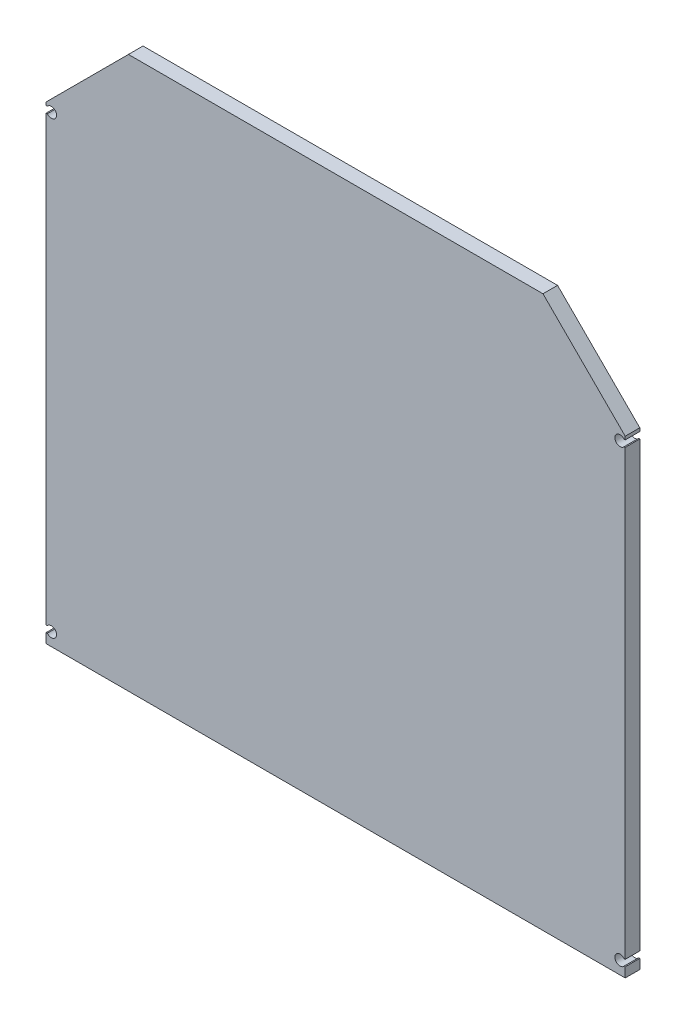
ISO-10303-21;
HEADER;
FILE_DESCRIPTION(('STEP AP214'),'2;1');
FILE_NAME('part.step','',(''),(''),'','','');
FILE_SCHEMA(('AUTOMOTIVE_DESIGN { 1 0 10303 214 1 1 1 1 }'));
ENDSEC;
DATA;
#1=APPLICATION_CONTEXT('core data for automotive mechanical design processes');
#2=APPLICATION_PROTOCOL_DEFINITION('international standard','automotive_design',2000,#1);
#3=PRODUCT_CONTEXT('',#1,'mechanical');
#4=PRODUCT('Part','Part','',(#3));
#5=PRODUCT_RELATED_PRODUCT_CATEGORY('part','',(#4));
#6=PRODUCT_DEFINITION_FORMATION('','',#4);
#7=PRODUCT_DEFINITION_CONTEXT('part definition',#1,'design');
#8=PRODUCT_DEFINITION('design','',#6,#7);
#9=PRODUCT_DEFINITION_SHAPE('','',#8);
#10=(LENGTH_UNIT() NAMED_UNIT(*) SI_UNIT(.MILLI.,.METRE.));
#11=(NAMED_UNIT(*) PLANE_ANGLE_UNIT() SI_UNIT($,.RADIAN.));
#12=(NAMED_UNIT(*) SI_UNIT($,.STERADIAN.) SOLID_ANGLE_UNIT());
#13=UNCERTAINTY_MEASURE_WITH_UNIT(LENGTH_MEASURE(1.E-05),#10,'distance_accuracy_value','');
#14=(GEOMETRIC_REPRESENTATION_CONTEXT(3) GLOBAL_UNCERTAINTY_ASSIGNED_CONTEXT((#13)) GLOBAL_UNIT_ASSIGNED_CONTEXT((#10,
#11,#12)) REPRESENTATION_CONTEXT('',''));
#15=CARTESIAN_POINT('',(0.,0.,0.));
#16=DIRECTION('',(0.,0.,1.));
#17=DIRECTION('',(1.,0.,0.));
#18=AXIS2_PLACEMENT_3D('',#15,#16,#17);
#19=CARTESIAN_POINT('',(-110.00463005735,72.3624357502469,5.6388));
#20=DIRECTION('',(0.,0.,-1.));
#21=DIRECTION('',(-1.,0.,0.));
#22=AXIS2_PLACEMENT_3D('',#19,#20,#21);
#23=CYLINDRICAL_SURFACE('',#22,1.99999999999999);
#24=CARTESIAN_POINT('',(-110.00463005735,72.3624357502469,0.));
#25=DIRECTION('',(0.,0.,-1.));
#26=DIRECTION('',(1.,0.,0.));
#27=AXIS2_PLACEMENT_3D('',#24,#25,#26);
#28=CIRCLE('',#27,1.99999999999999);
#29=CARTESIAN_POINT('',(-111.565879556949,73.6124357502469,0.));
#30=VERTEX_POINT('',#29);
#31=CARTESIAN_POINT('',(-111.565879556949,71.1124357502469,0.));
#32=VERTEX_POINT('',#31);
#33=EDGE_CURVE('E213',#30,#32,#28,.T.);
#34=ORIENTED_EDGE('',*,*,#33,.T.);
#35=DIRECTION('',(0.,0.,-1.));
#36=VECTOR('',#35,1.);
#37=CARTESIAN_POINT('',(-111.565879556949,71.1124357502469,5.6388));
#38=LINE('',#37,#36);
#39=CARTESIAN_POINT('',(-111.565879556949,71.1124357502469,5.6388));
#40=VERTEX_POINT('',#39);
#41=EDGE_CURVE('E11',#40,#32,#38,.T.);
#42=ORIENTED_EDGE('',*,*,#41,.F.);
#43=CARTESIAN_POINT('',(-110.00463005735,72.3624357502469,5.6388));
#44=DIRECTION('',(0.,0.,-1.));
#45=DIRECTION('',(1.,0.,0.));
#46=AXIS2_PLACEMENT_3D('',#43,#44,#45);
#47=CIRCLE('',#46,1.99999999999999);
#48=CARTESIAN_POINT('',(-111.565879556949,73.6124357502469,5.6388));
#49=VERTEX_POINT('',#48);
#50=EDGE_CURVE('E255',#49,#40,#47,.T.);
#51=ORIENTED_EDGE('',*,*,#50,.F.);
#52=DIRECTION('',(0.,0.,-1.));
#53=VECTOR('',#52,1.);
#54=CARTESIAN_POINT('',(-111.565879556949,73.6124357502469,5.6388));
#55=LINE('',#54,#53);
#56=EDGE_CURVE('E209',#49,#30,#55,.T.);
#57=ORIENTED_EDGE('',*,*,#56,.T.);
#58=EDGE_LOOP('',(#34,#42,#51,#57));
#59=FACE_BOUND('',#58,.T.);
#60=ADVANCED_FACE('F33',(#59),#23,.F.);
#61=CARTESIAN_POINT('',(-111.565879556949,71.1124357502469,5.6388));
#62=DIRECTION('',(0.,-1.,0.));
#63=DIRECTION('',(0.,0.,-1.));
#64=AXIS2_PLACEMENT_3D('',#61,#62,#63);
#65=PLANE('',#64);
#66=DIRECTION('',(-1.,0.,0.));
#67=VECTOR('',#66,1.);
#68=CARTESIAN_POINT('',(-111.565879556949,71.1124357502469,0.));
#69=LINE('',#68,#67);
#70=CARTESIAN_POINT('',(-112.00463005735,71.1124357502469,0.));
#71=VERTEX_POINT('',#70);
#72=EDGE_CURVE('E216',#32,#71,#69,.T.);
#73=ORIENTED_EDGE('',*,*,#72,.T.);
#74=DIRECTION('',(0.,0.,-1.));
#75=VECTOR('',#74,1.);
#76=CARTESIAN_POINT('',(-112.00463005735,71.1124357502469,5.6388));
#77=LINE('',#76,#75);
#78=CARTESIAN_POINT('',(-112.00463005735,71.1124357502469,5.6388));
#79=VERTEX_POINT('',#78);
#80=EDGE_CURVE('E41',#79,#71,#77,.T.);
#81=ORIENTED_EDGE('',*,*,#80,.F.);
#82=DIRECTION('',(-1.,0.,0.));
#83=VECTOR('',#82,1.);
#84=CARTESIAN_POINT('',(-111.565879556949,71.1124357502469,5.6388));
#85=LINE('',#84,#83);
#86=EDGE_CURVE('E134',#40,#79,#85,.T.);
#87=ORIENTED_EDGE('',*,*,#86,.F.);
#88=ORIENTED_EDGE('',*,*,#41,.T.);
#89=EDGE_LOOP('',(#73,#81,#87,#88));
#90=FACE_BOUND('',#89,.T.);
#91=ADVANCED_FACE('F383',(#90),#65,.F.);
#92=CARTESIAN_POINT('',(-112.00463005735,71.1124357502469,5.6388));
#93=DIRECTION('',(1.,0.,0.));
#94=DIRECTION('',(0.,1.,0.));
#95=AXIS2_PLACEMENT_3D('',#92,#93,#94);
#96=PLANE('',#95);
#97=DIRECTION('',(0.,-1.,0.));
#98=VECTOR('',#97,1.);
#99=CARTESIAN_POINT('',(-112.00463005735,71.1124357502469,0.));
#100=LINE('',#99,#98);
#101=CARTESIAN_POINT('',(-112.00463005735,-100.425,0.));
#102=VERTEX_POINT('',#101);
#103=EDGE_CURVE('E218',#71,#102,#100,.T.);
#104=ORIENTED_EDGE('',*,*,#103,.T.);
#105=DIRECTION('',(0.,0.,-1.));
#106=VECTOR('',#105,1.);
#107=CARTESIAN_POINT('',(-112.00463005735,-100.425,5.6388));
#108=LINE('',#107,#106);
#109=CARTESIAN_POINT('',(-112.00463005735,-100.425,5.6388));
#110=VERTEX_POINT('',#109);
#111=EDGE_CURVE('E304',#110,#102,#108,.T.);
#112=ORIENTED_EDGE('',*,*,#111,.F.);
#113=DIRECTION('',(0.,-1.,0.));
#114=VECTOR('',#113,1.);
#115=CARTESIAN_POINT('',(-112.00463005735,71.1124357502469,5.6388));
#116=LINE('',#115,#114);
#117=EDGE_CURVE('E312',#79,#110,#116,.T.);
#118=ORIENTED_EDGE('',*,*,#117,.F.);
#119=ORIENTED_EDGE('',*,*,#80,.T.);
#120=EDGE_LOOP('',(#104,#112,#118,#119));
#121=FACE_BOUND('',#120,.T.);
#122=ADVANCED_FACE('F310',(#121),#96,.F.);
#123=CARTESIAN_POINT('',(-112.00463005735,-100.425,5.6388));
#124=DIRECTION('',(0.,1.,0.));
#125=DIRECTION('',(0.,0.,1.));
#126=AXIS2_PLACEMENT_3D('',#123,#124,#125);
#127=PLANE('',#126);
#128=DIRECTION('',(1.,0.,0.));
#129=VECTOR('',#128,1.);
#130=CARTESIAN_POINT('',(-112.00463005735,-100.425,0.));
#131=LINE('',#130,#129);
#132=CARTESIAN_POINT('',(-111.565879556949,-100.425,0.));
#133=VERTEX_POINT('',#132);
#134=EDGE_CURVE('E220',#102,#133,#131,.T.);
#135=ORIENTED_EDGE('',*,*,#134,.T.);
#136=DIRECTION('',(0.,0.,-1.));
#137=VECTOR('',#136,1.);
#138=CARTESIAN_POINT('',(-111.565879556949,-100.425,5.6388));
#139=LINE('',#138,#137);
#140=CARTESIAN_POINT('',(-111.565879556949,-100.425,5.6388));
#141=VERTEX_POINT('',#140);
#142=EDGE_CURVE('E301',#141,#133,#139,.T.);
#143=ORIENTED_EDGE('',*,*,#142,.F.);
#144=DIRECTION('',(1.,0.,0.));
#145=VECTOR('',#144,1.);
#146=CARTESIAN_POINT('',(-112.00463005735,-100.425,5.6388));
#147=LINE('',#146,#145);
#148=EDGE_CURVE('E330',#110,#141,#147,.T.);
#149=ORIENTED_EDGE('',*,*,#148,.F.);
#150=ORIENTED_EDGE('',*,*,#111,.T.);
#151=EDGE_LOOP('',(#135,#143,#149,#150));
#152=FACE_BOUND('',#151,.T.);
#153=ADVANCED_FACE('F321',(#152),#127,.F.);
#154=CARTESIAN_POINT('',(-110.00463005735,-101.675,5.6388));
#155=DIRECTION('',(0.,0.,-1.));
#156=DIRECTION('',(-1.,0.,0.));
#157=AXIS2_PLACEMENT_3D('',#154,#155,#156);
#158=CYLINDRICAL_SURFACE('',#157,1.99999999999998);
#159=CARTESIAN_POINT('',(-110.00463005735,-101.675,0.));
#160=DIRECTION('',(0.,0.,-1.));
#161=DIRECTION('',(-1.,0.,0.));
#162=AXIS2_PLACEMENT_3D('',#159,#160,#161);
#163=CIRCLE('',#162,1.99999999999998);
#164=CARTESIAN_POINT('',(-111.565879556949,-102.925,0.));
#165=VERTEX_POINT('',#164);
#166=EDGE_CURVE('E222',#133,#165,#163,.T.);
#167=ORIENTED_EDGE('',*,*,#166,.T.);
#168=DIRECTION('',(0.,0.,-1.));
#169=VECTOR('',#168,1.);
#170=CARTESIAN_POINT('',(-111.565879556949,-102.925,5.6388));
#171=LINE('',#170,#169);
#172=CARTESIAN_POINT('',(-111.565879556949,-102.925,5.6388));
#173=VERTEX_POINT('',#172);
#174=EDGE_CURVE('E298',#173,#165,#171,.T.);
#175=ORIENTED_EDGE('',*,*,#174,.F.);
#176=CARTESIAN_POINT('',(-110.00463005735,-101.675,5.6388));
#177=DIRECTION('',(0.,0.,-1.));
#178=DIRECTION('',(-1.,0.,0.));
#179=AXIS2_PLACEMENT_3D('',#176,#177,#178);
#180=CIRCLE('',#179,1.99999999999998);
#181=EDGE_CURVE('E327',#141,#173,#180,.T.);
#182=ORIENTED_EDGE('',*,*,#181,.F.);
#183=ORIENTED_EDGE('',*,*,#142,.T.);
#184=EDGE_LOOP('',(#167,#175,#182,#183));
#185=FACE_BOUND('',#184,.T.);
#186=ADVANCED_FACE('F325',(#185),#158,.F.);
#187=CARTESIAN_POINT('',(-111.565879556949,-102.925,5.6388));
#188=DIRECTION('',(0.,-1.,0.));
#189=DIRECTION('',(0.,0.,-1.));
#190=AXIS2_PLACEMENT_3D('',#187,#188,#189);
#191=PLANE('',#190);
#192=DIRECTION('',(-1.,0.,0.));
#193=VECTOR('',#192,1.);
#194=CARTESIAN_POINT('',(-111.565879556949,-102.925,0.));
#195=LINE('',#194,#193);
#196=CARTESIAN_POINT('',(-112.00463005735,-102.925,0.));
#197=VERTEX_POINT('',#196);
#198=EDGE_CURVE('E224',#165,#197,#195,.T.);
#199=ORIENTED_EDGE('',*,*,#198,.T.);
#200=DIRECTION('',(0.,0.,-1.));
#201=VECTOR('',#200,1.);
#202=CARTESIAN_POINT('',(-112.00463005735,-102.925,5.6388));
#203=LINE('',#202,#201);
#204=CARTESIAN_POINT('',(-112.00463005735,-102.925,5.6388));
#205=VERTEX_POINT('',#204);
#206=EDGE_CURVE('E295',#205,#197,#203,.T.);
#207=ORIENTED_EDGE('',*,*,#206,.F.);
#208=DIRECTION('',(-1.,0.,0.));
#209=VECTOR('',#208,1.);
#210=CARTESIAN_POINT('',(-111.565879556949,-102.925,5.6388));
#211=LINE('',#210,#209);
#212=EDGE_CURVE('E329',#173,#205,#211,.T.);
#213=ORIENTED_EDGE('',*,*,#212,.F.);
#214=ORIENTED_EDGE('',*,*,#174,.T.);
#215=EDGE_LOOP('',(#199,#207,#213,#214));
#216=FACE_BOUND('',#215,.T.);
#217=ADVANCED_FACE('F396',(#216),#191,.F.);
#218=CARTESIAN_POINT('',(-112.00463005735,-102.925,5.6388));
#219=DIRECTION('',(1.,0.,0.));
#220=DIRECTION('',(0.,0.,-1.));
#221=AXIS2_PLACEMENT_3D('',#218,#219,#220);
#222=PLANE('',#221);
#223=DIRECTION('',(0.,-1.,0.));
#224=VECTOR('',#223,1.);
#225=CARTESIAN_POINT('',(-112.00463005735,-102.925,0.));
#226=LINE('',#225,#224);
#227=CARTESIAN_POINT('',(-112.00463005735,-106.675,0.));
#228=VERTEX_POINT('',#227);
#229=EDGE_CURVE('E226',#197,#228,#226,.T.);
#230=ORIENTED_EDGE('',*,*,#229,.T.);
#231=DIRECTION('',(0.,0.,-1.));
#232=VECTOR('',#231,1.);
#233=CARTESIAN_POINT('',(-112.00463005735,-106.675,5.6388));
#234=LINE('',#233,#232);
#235=CARTESIAN_POINT('',(-112.00463005735,-106.675,5.6388));
#236=VERTEX_POINT('',#235);
#237=EDGE_CURVE('E292',#236,#228,#234,.T.);
#238=ORIENTED_EDGE('',*,*,#237,.F.);
#239=DIRECTION('',(0.,-1.,0.));
#240=VECTOR('',#239,1.);
#241=CARTESIAN_POINT('',(-112.00463005735,-102.925,5.6388));
#242=LINE('',#241,#240);
#243=EDGE_CURVE('E332',#205,#236,#242,.T.);
#244=ORIENTED_EDGE('',*,*,#243,.F.);
#245=ORIENTED_EDGE('',*,*,#206,.T.);
#246=EDGE_LOOP('',(#230,#238,#244,#245));
#247=FACE_BOUND('',#246,.T.);
#248=ADVANCED_FACE('F399',(#247),#222,.F.);
#249=CARTESIAN_POINT('',(-112.00463005735,-106.675,5.6388));
#250=DIRECTION('',(0.,1.,0.));
#251=DIRECTION('',(-1.,0.,0.));
#252=AXIS2_PLACEMENT_3D('',#249,#250,#251);
#253=PLANE('',#252);
#254=DIRECTION('',(1.,0.,0.));
#255=VECTOR('',#254,1.);
#256=CARTESIAN_POINT('',(-112.00463005735,-106.675,0.));
#257=LINE('',#256,#255);
#258=CARTESIAN_POINT('',(112.004630057349,-106.675,0.));
#259=VERTEX_POINT('',#258);
#260=EDGE_CURVE('E228',#228,#259,#257,.T.);
#261=ORIENTED_EDGE('',*,*,#260,.T.);
#262=DIRECTION('',(0.,0.,-1.));
#263=VECTOR('',#262,1.);
#264=CARTESIAN_POINT('',(112.004630057349,-106.675,5.6388));
#265=LINE('',#264,#263);
#266=CARTESIAN_POINT('',(112.004630057349,-106.675,5.6388));
#267=VERTEX_POINT('',#266);
#268=EDGE_CURVE('E289',#267,#259,#265,.T.);
#269=ORIENTED_EDGE('',*,*,#268,.F.);
#270=DIRECTION('',(1.,0.,0.));
#271=VECTOR('',#270,1.);
#272=CARTESIAN_POINT('',(-112.00463005735,-106.675,5.6388));
#273=LINE('',#272,#271);
#274=EDGE_CURVE('E338',#236,#267,#273,.T.);
#275=ORIENTED_EDGE('',*,*,#274,.F.);
#276=ORIENTED_EDGE('',*,*,#237,.T.);
#277=EDGE_LOOP('',(#261,#269,#275,#276));
#278=FACE_BOUND('',#277,.T.);
#279=ADVANCED_FACE('F403',(#278),#253,.F.);
#280=CARTESIAN_POINT('',(112.004630057349,-106.675,5.6388));
#281=DIRECTION('',(-1.,0.,0.));
#282=DIRECTION('',(0.,0.,1.));
#283=AXIS2_PLACEMENT_3D('',#280,#281,#282);
#284=PLANE('',#283);
#285=DIRECTION('',(0.,1.,0.));
#286=VECTOR('',#285,1.);
#287=CARTESIAN_POINT('',(112.004630057349,-106.675,0.));
#288=LINE('',#287,#286);
#289=CARTESIAN_POINT('',(112.004630057349,-102.925,0.));
#290=VERTEX_POINT('',#289);
#291=EDGE_CURVE('E230',#259,#290,#288,.T.);
#292=ORIENTED_EDGE('',*,*,#291,.T.);
#293=DIRECTION('',(0.,0.,-1.));
#294=VECTOR('',#293,1.);
#295=CARTESIAN_POINT('',(112.004630057349,-102.925,5.6388));
#296=LINE('',#295,#294);
#297=CARTESIAN_POINT('',(112.004630057349,-102.925,5.6388));
#298=VERTEX_POINT('',#297);
#299=EDGE_CURVE('E286',#298,#290,#296,.T.);
#300=ORIENTED_EDGE('',*,*,#299,.F.);
#301=DIRECTION('',(0.,1.,0.));
#302=VECTOR('',#301,1.);
#303=CARTESIAN_POINT('',(112.004630057349,-106.675,5.6388));
#304=LINE('',#303,#302);
#305=EDGE_CURVE('E340',#267,#298,#304,.T.);
#306=ORIENTED_EDGE('',*,*,#305,.F.);
#307=ORIENTED_EDGE('',*,*,#268,.T.);
#308=EDGE_LOOP('',(#292,#300,#306,#307));
#309=FACE_BOUND('',#308,.T.);
#310=ADVANCED_FACE('F407',(#309),#284,.F.);
#311=CARTESIAN_POINT('',(112.004630057349,-102.925,5.6388));
#312=DIRECTION('',(0.,-1.,0.));
#313=DIRECTION('',(0.,0.,-1.));
#314=AXIS2_PLACEMENT_3D('',#311,#312,#313);
#315=PLANE('',#314);
#316=DIRECTION('',(-1.,0.,0.));
#317=VECTOR('',#316,1.);
#318=CARTESIAN_POINT('',(112.004630057349,-102.925,0.));
#319=LINE('',#318,#317);
#320=CARTESIAN_POINT('',(111.565879556949,-102.925,0.));
#321=VERTEX_POINT('',#320);
#322=EDGE_CURVE('E232',#290,#321,#319,.T.);
#323=ORIENTED_EDGE('',*,*,#322,.T.);
#324=DIRECTION('',(0.,0.,-1.));
#325=VECTOR('',#324,1.);
#326=CARTESIAN_POINT('',(111.565879556949,-102.925,5.6388));
#327=LINE('',#326,#325);
#328=CARTESIAN_POINT('',(111.565879556949,-102.925,5.6388));
#329=VERTEX_POINT('',#328);
#330=EDGE_CURVE('E283',#329,#321,#327,.T.);
#331=ORIENTED_EDGE('',*,*,#330,.F.);
#332=DIRECTION('',(-1.,0.,0.));
#333=VECTOR('',#332,1.);
#334=CARTESIAN_POINT('',(112.004630057349,-102.925,5.6388));
#335=LINE('',#334,#333);
#336=EDGE_CURVE('E342',#298,#329,#335,.T.);
#337=ORIENTED_EDGE('',*,*,#336,.F.);
#338=ORIENTED_EDGE('',*,*,#299,.T.);
#339=EDGE_LOOP('',(#323,#331,#337,#338));
#340=FACE_BOUND('',#339,.T.);
#341=ADVANCED_FACE('F411',(#340),#315,.F.);
#342=CARTESIAN_POINT('',(110.00463005735,-101.675,5.6388));
#343=DIRECTION('',(0.,0.,-1.));
#344=DIRECTION('',(-1.,0.,0.));
#345=AXIS2_PLACEMENT_3D('',#342,#343,#344);
#346=CYLINDRICAL_SURFACE('',#345,2.00000000000001);
#347=CARTESIAN_POINT('',(110.00463005735,-101.675,0.));
#348=DIRECTION('',(0.,0.,-1.));
#349=DIRECTION('',(1.,0.,0.));
#350=AXIS2_PLACEMENT_3D('',#347,#348,#349);
#351=CIRCLE('',#350,2.00000000000001);
#352=CARTESIAN_POINT('',(111.565879556949,-100.425,0.));
#353=VERTEX_POINT('',#352);
#354=EDGE_CURVE('E234',#321,#353,#351,.T.);
#355=ORIENTED_EDGE('',*,*,#354,.T.);
#356=DIRECTION('',(0.,0.,-1.));
#357=VECTOR('',#356,1.);
#358=CARTESIAN_POINT('',(111.565879556949,-100.425,5.6388));
#359=LINE('',#358,#357);
#360=CARTESIAN_POINT('',(111.565879556949,-100.425,5.6388));
#361=VERTEX_POINT('',#360);
#362=EDGE_CURVE('E280',#361,#353,#359,.T.);
#363=ORIENTED_EDGE('',*,*,#362,.F.);
#364=CARTESIAN_POINT('',(110.00463005735,-101.675,5.6388));
#365=DIRECTION('',(0.,0.,-1.));
#366=DIRECTION('',(1.,0.,0.));
#367=AXIS2_PLACEMENT_3D('',#364,#365,#366);
#368=CIRCLE('',#367,2.00000000000001);
#369=EDGE_CURVE('E344',#329,#361,#368,.T.);
#370=ORIENTED_EDGE('',*,*,#369,.F.);
#371=ORIENTED_EDGE('',*,*,#330,.T.);
#372=EDGE_LOOP('',(#355,#363,#370,#371));
#373=FACE_BOUND('',#372,.T.);
#374=ADVANCED_FACE('F415',(#373),#346,.F.);
#375=CARTESIAN_POINT('',(112.004630057349,-100.425,5.6388));
#376=DIRECTION('',(0.,1.,0.));
#377=DIRECTION('',(0.,0.,1.));
#378=AXIS2_PLACEMENT_3D('',#375,#376,#377);
#379=PLANE('',#378);
#380=DIRECTION('',(1.,0.,0.));
#381=VECTOR('',#380,1.);
#382=CARTESIAN_POINT('',(112.004630057349,-100.425,0.));
#383=LINE('',#382,#381);
#384=CARTESIAN_POINT('',(112.004630057349,-100.425,0.));
#385=VERTEX_POINT('',#384);
#386=EDGE_CURVE('E236',#353,#385,#383,.T.);
#387=ORIENTED_EDGE('',*,*,#386,.T.);
#388=DIRECTION('',(0.,0.,-1.));
#389=VECTOR('',#388,1.);
#390=CARTESIAN_POINT('',(112.004630057349,-100.425,5.6388));
#391=LINE('',#390,#389);
#392=CARTESIAN_POINT('',(112.004630057349,-100.425,5.6388));
#393=VERTEX_POINT('',#392);
#394=EDGE_CURVE('E277',#393,#385,#391,.T.);
#395=ORIENTED_EDGE('',*,*,#394,.F.);
#396=DIRECTION('',(1.,0.,0.));
#397=VECTOR('',#396,1.);
#398=CARTESIAN_POINT('',(112.004630057349,-100.425,5.6388));
#399=LINE('',#398,#397);
#400=EDGE_CURVE('E346',#361,#393,#399,.T.);
#401=ORIENTED_EDGE('',*,*,#400,.F.);
#402=ORIENTED_EDGE('',*,*,#362,.T.);
#403=EDGE_LOOP('',(#387,#395,#401,#402));
#404=FACE_BOUND('',#403,.T.);
#405=ADVANCED_FACE('F419',(#404),#379,.F.);
#406=CARTESIAN_POINT('',(112.004630057349,71.1124357502469,5.6388));
#407=DIRECTION('',(-1.,0.,0.));
#408=DIRECTION('',(0.,-1.,0.));
#409=AXIS2_PLACEMENT_3D('',#406,#407,#408);
#410=PLANE('',#409);
#411=DIRECTION('',(0.,1.,0.));
#412=VECTOR('',#411,1.);
#413=CARTESIAN_POINT('',(112.004630057349,71.1124357502469,0.));
#414=LINE('',#413,#412);
#415=CARTESIAN_POINT('',(112.004630057349,71.1124357502469,0.));
#416=VERTEX_POINT('',#415);
#417=EDGE_CURVE('E238',#385,#416,#414,.T.);
#418=ORIENTED_EDGE('',*,*,#417,.T.);
#419=DIRECTION('',(0.,0.,-1.));
#420=VECTOR('',#419,1.);
#421=CARTESIAN_POINT('',(112.004630057349,71.1124357502469,5.6388));
#422=LINE('',#421,#420);
#423=CARTESIAN_POINT('',(112.004630057349,71.1124357502469,5.6388));
#424=VERTEX_POINT('',#423);
#425=EDGE_CURVE('E274',#424,#416,#422,.T.);
#426=ORIENTED_EDGE('',*,*,#425,.F.);
#427=DIRECTION('',(0.,1.,0.));
#428=VECTOR('',#427,1.);
#429=CARTESIAN_POINT('',(112.004630057349,71.1124357502469,5.6388));
#430=LINE('',#429,#428);
#431=EDGE_CURVE('E348',#393,#424,#430,.T.);
#432=ORIENTED_EDGE('',*,*,#431,.F.);
#433=ORIENTED_EDGE('',*,*,#394,.T.);
#434=EDGE_LOOP('',(#418,#426,#432,#433));
#435=FACE_BOUND('',#434,.T.);
#436=ADVANCED_FACE('F423',(#435),#410,.F.);
#437=CARTESIAN_POINT('',(111.565879556949,71.1124357502469,5.6388));
#438=DIRECTION('',(0.,-1.,0.));
#439=DIRECTION('',(0.,0.,-1.));
#440=AXIS2_PLACEMENT_3D('',#437,#438,#439);
#441=PLANE('',#440);
#442=DIRECTION('',(-1.,0.,0.));
#443=VECTOR('',#442,1.);
#444=CARTESIAN_POINT('',(111.565879556949,71.1124357502469,0.));
#445=LINE('',#444,#443);
#446=CARTESIAN_POINT('',(111.565879556949,71.1124357502469,0.));
#447=VERTEX_POINT('',#446);
#448=EDGE_CURVE('E240',#416,#447,#445,.T.);
#449=ORIENTED_EDGE('',*,*,#448,.T.);
#450=DIRECTION('',(0.,0.,-1.));
#451=VECTOR('',#450,1.);
#452=CARTESIAN_POINT('',(111.565879556949,71.1124357502469,5.6388));
#453=LINE('',#452,#451);
#454=CARTESIAN_POINT('',(111.565879556949,71.1124357502469,5.6388));
#455=VERTEX_POINT('',#454);
#456=EDGE_CURVE('E271',#455,#447,#453,.T.);
#457=ORIENTED_EDGE('',*,*,#456,.F.);
#458=DIRECTION('',(-1.,0.,0.));
#459=VECTOR('',#458,1.);
#460=CARTESIAN_POINT('',(111.565879556949,71.1124357502469,5.6388));
#461=LINE('',#460,#459);
#462=EDGE_CURVE('E350',#424,#455,#461,.T.);
#463=ORIENTED_EDGE('',*,*,#462,.F.);
#464=ORIENTED_EDGE('',*,*,#425,.T.);
#465=EDGE_LOOP('',(#449,#457,#463,#464));
#466=FACE_BOUND('',#465,.T.);
#467=ADVANCED_FACE('F427',(#466),#441,.F.);
#468=CARTESIAN_POINT('',(110.004630057349,72.3624357502469,5.6388));
#469=DIRECTION('',(0.,0.,-1.));
#470=DIRECTION('',(-1.,0.,0.));
#471=AXIS2_PLACEMENT_3D('',#468,#469,#470);
#472=CYLINDRICAL_SURFACE('',#471,1.99999999999998);
#473=CARTESIAN_POINT('',(110.004630057349,72.3624357502469,0.));
#474=DIRECTION('',(0.,0.,-1.));
#475=DIRECTION('',(1.,0.,0.));
#476=AXIS2_PLACEMENT_3D('',#473,#474,#475);
#477=CIRCLE('',#476,1.99999999999998);
#478=CARTESIAN_POINT('',(111.565879556949,73.6124357502469,0.));
#479=VERTEX_POINT('',#478);
#480=EDGE_CURVE('E242',#447,#479,#477,.T.);
#481=ORIENTED_EDGE('',*,*,#480,.T.);
#482=DIRECTION('',(0.,0.,-1.));
#483=VECTOR('',#482,1.);
#484=CARTESIAN_POINT('',(111.565879556949,73.6124357502469,5.6388));
#485=LINE('',#484,#483);
#486=CARTESIAN_POINT('',(111.565879556949,73.6124357502469,5.6388));
#487=VERTEX_POINT('',#486);
#488=EDGE_CURVE('E268',#487,#479,#485,.T.);
#489=ORIENTED_EDGE('',*,*,#488,.F.);
#490=CARTESIAN_POINT('',(110.004630057349,72.3624357502469,5.6388));
#491=DIRECTION('',(0.,0.,-1.));
#492=DIRECTION('',(1.,0.,0.));
#493=AXIS2_PLACEMENT_3D('',#490,#491,#492);
#494=CIRCLE('',#493,1.99999999999998);
#495=EDGE_CURVE('E352',#455,#487,#494,.T.);
#496=ORIENTED_EDGE('',*,*,#495,.F.);
#497=ORIENTED_EDGE('',*,*,#456,.T.);
#498=EDGE_LOOP('',(#481,#489,#496,#497));
#499=FACE_BOUND('',#498,.T.);
#500=ADVANCED_FACE('F431',(#499),#472,.F.);
#501=CARTESIAN_POINT('',(112.004630057349,73.6124357502469,5.6388));
#502=DIRECTION('',(0.,1.,0.));
#503=DIRECTION('',(0.,0.,1.));
#504=AXIS2_PLACEMENT_3D('',#501,#502,#503);
#505=PLANE('',#504);
#506=DIRECTION('',(1.,0.,0.));
#507=VECTOR('',#506,1.);
#508=CARTESIAN_POINT('',(112.004630057349,73.6124357502469,0.));
#509=LINE('',#508,#507);
#510=CARTESIAN_POINT('',(112.004630057349,73.6124357502469,0.));
#511=VERTEX_POINT('',#510);
#512=EDGE_CURVE('E244',#479,#511,#509,.T.);
#513=ORIENTED_EDGE('',*,*,#512,.T.);
#514=DIRECTION('',(0.,0.,-1.));
#515=VECTOR('',#514,1.);
#516=CARTESIAN_POINT('',(112.004630057349,73.6124357502469,5.6388));
#517=LINE('',#516,#515);
#518=CARTESIAN_POINT('',(112.004630057349,73.6124357502469,5.6388));
#519=VERTEX_POINT('',#518);
#520=EDGE_CURVE('E265',#519,#511,#517,.T.);
#521=ORIENTED_EDGE('',*,*,#520,.F.);
#522=DIRECTION('',(1.,0.,0.));
#523=VECTOR('',#522,1.);
#524=CARTESIAN_POINT('',(112.004630057349,73.6124357502469,5.6388));
#525=LINE('',#524,#523);
#526=EDGE_CURVE('E354',#487,#519,#525,.T.);
#527=ORIENTED_EDGE('',*,*,#526,.F.);
#528=ORIENTED_EDGE('',*,*,#488,.T.);
#529=EDGE_LOOP('',(#513,#521,#527,#528));
#530=FACE_BOUND('',#529,.T.);
#531=ADVANCED_FACE('F435',(#530),#505,.F.);
#532=CARTESIAN_POINT('',(112.004630057349,74.8624357502469,5.6388));
#533=DIRECTION('',(-1.,0.,0.));
#534=DIRECTION('',(0.,-1.,0.));
#535=AXIS2_PLACEMENT_3D('',#532,#533,#534);
#536=PLANE('',#535);
#537=DIRECTION('',(0.,1.,0.));
#538=VECTOR('',#537,1.);
#539=CARTESIAN_POINT('',(112.004630057349,74.8624357502469,0.));
#540=LINE('',#539,#538);
#541=CARTESIAN_POINT('',(112.004630057349,74.8624357502469,0.));
#542=VERTEX_POINT('',#541);
#543=EDGE_CURVE('E246',#511,#542,#540,.T.);
#544=ORIENTED_EDGE('',*,*,#543,.T.);
#545=DIRECTION('',(0.,0.,-1.));
#546=VECTOR('',#545,1.);
#547=CARTESIAN_POINT('',(112.004630057349,74.8624357502469,5.6388));
#548=LINE('',#547,#546);
#549=CARTESIAN_POINT('',(112.004630057349,74.8624357502469,5.6388));
#550=VERTEX_POINT('',#549);
#551=EDGE_CURVE('E262',#550,#542,#548,.T.);
#552=ORIENTED_EDGE('',*,*,#551,.F.);
#553=DIRECTION('',(0.,1.,0.));
#554=VECTOR('',#553,1.);
#555=CARTESIAN_POINT('',(112.004630057349,74.8624357502469,5.6388));
#556=LINE('',#555,#554);
#557=EDGE_CURVE('E356',#519,#550,#556,.T.);
#558=ORIENTED_EDGE('',*,*,#557,.F.);
#559=ORIENTED_EDGE('',*,*,#520,.T.);
#560=EDGE_LOOP('',(#544,#552,#558,#559));
#561=FACE_BOUND('',#560,.T.);
#562=ADVANCED_FACE('F439',(#561),#536,.F.);
#563=CARTESIAN_POINT('',(80.192037686397,106.675,5.6388));
#564=DIRECTION('',(-0.707106468657724,-0.707107093715233,0.));
#565=DIRECTION('',(0.707107093715233,-0.707106468657724,0.));
#566=AXIS2_PLACEMENT_3D('',#563,#564,#565);
#567=PLANE('',#566);
#568=DIRECTION('',(-0.707107093715233,0.707106468657724,0.));
#569=VECTOR('',#568,1.);
#570=CARTESIAN_POINT('',(80.192037686397,106.675,0.));
#571=LINE('',#570,#569);
#572=CARTESIAN_POINT('',(80.192037686397,106.675,0.));
#573=VERTEX_POINT('',#572);
#574=EDGE_CURVE('E248',#542,#573,#571,.T.);
#575=ORIENTED_EDGE('',*,*,#574,.T.);
#576=DIRECTION('',(0.,0.,-1.));
#577=VECTOR('',#576,1.);
#578=CARTESIAN_POINT('',(80.192037686397,106.675,5.6388));
#579=LINE('',#578,#577);
#580=CARTESIAN_POINT('',(80.192037686397,106.675,5.6388));
#581=VERTEX_POINT('',#580);
#582=EDGE_CURVE('E259',#581,#573,#579,.T.);
#583=ORIENTED_EDGE('',*,*,#582,.F.);
#584=DIRECTION('',(-0.707107093715233,0.707106468657724,0.));
#585=VECTOR('',#584,1.);
#586=CARTESIAN_POINT('',(80.192037686397,106.675,5.6388));
#587=LINE('',#586,#585);
#588=EDGE_CURVE('E358',#550,#581,#587,.T.);
#589=ORIENTED_EDGE('',*,*,#588,.F.);
#590=ORIENTED_EDGE('',*,*,#551,.T.);
#591=EDGE_LOOP('',(#575,#583,#589,#590));
#592=FACE_BOUND('',#591,.T.);
#593=ADVANCED_FACE('F364',(#592),#567,.F.);
#594=CARTESIAN_POINT('',(-80.1920376863972,106.675,5.6388));
#595=DIRECTION('',(0.,-1.,0.));
#596=DIRECTION('',(1.,0.,0.));
#597=AXIS2_PLACEMENT_3D('',#594,#595,#596);
#598=PLANE('',#597);
#599=DIRECTION('',(-1.,0.,0.));
#600=VECTOR('',#599,1.);
#601=CARTESIAN_POINT('',(-80.1920376863972,106.675,0.));
#602=LINE('',#601,#600);
#603=CARTESIAN_POINT('',(-80.1920376863972,106.675,0.));
#604=VERTEX_POINT('',#603);
#605=EDGE_CURVE('E250',#573,#604,#602,.T.);
#606=ORIENTED_EDGE('',*,*,#605,.T.);
#607=DIRECTION('',(0.,0.,-1.));
#608=VECTOR('',#607,1.);
#609=CARTESIAN_POINT('',(-80.1920376863972,106.675,5.6388));
#610=LINE('',#609,#608);
#611=CARTESIAN_POINT('',(-80.1920376863972,106.675,5.6388));
#612=VERTEX_POINT('',#611);
#613=EDGE_CURVE('E204',#612,#604,#610,.T.);
#614=ORIENTED_EDGE('',*,*,#613,.F.);
#615=DIRECTION('',(-1.,0.,0.));
#616=VECTOR('',#615,1.);
#617=CARTESIAN_POINT('',(-80.1920376863972,106.675,5.6388));
#618=LINE('',#617,#616);
#619=EDGE_CURVE('E195',#581,#612,#618,.T.);
#620=ORIENTED_EDGE('',*,*,#619,.F.);
#621=ORIENTED_EDGE('',*,*,#582,.T.);
#622=EDGE_LOOP('',(#606,#614,#620,#621));
#623=FACE_BOUND('',#622,.T.);
#624=ADVANCED_FACE('F368',(#623),#598,.F.);
#625=CARTESIAN_POINT('',(-112.00463005735,74.8624357502469,5.6388));
#626=DIRECTION('',(0.707106468657724,-0.707107093715233,0.));
#627=DIRECTION('',(0.707107093715233,0.707106468657724,0.));
#628=AXIS2_PLACEMENT_3D('',#625,#626,#627);
#629=PLANE('',#628);
#630=DIRECTION('',(-0.707107093715233,-0.707106468657724,0.));
#631=VECTOR('',#630,1.);
#632=CARTESIAN_POINT('',(-112.00463005735,74.8624357502469,0.));
#633=LINE('',#632,#631);
#634=CARTESIAN_POINT('',(-112.00463005735,74.8624357502469,0.));
#635=VERTEX_POINT('',#634);
#636=EDGE_CURVE('E203',#604,#635,#633,.T.);
#637=ORIENTED_EDGE('',*,*,#636,.T.);
#638=DIRECTION('',(0.,0.,-1.));
#639=VECTOR('',#638,1.);
#640=CARTESIAN_POINT('',(-112.00463005735,74.8624357502469,5.6388));
#641=LINE('',#640,#639);
#642=CARTESIAN_POINT('',(-112.00463005735,74.8624357502469,5.6388));
#643=VERTEX_POINT('',#642);
#644=EDGE_CURVE('E200',#643,#635,#641,.T.);
#645=ORIENTED_EDGE('',*,*,#644,.F.);
#646=DIRECTION('',(-0.707107093715233,-0.707106468657724,0.));
#647=VECTOR('',#646,1.);
#648=CARTESIAN_POINT('',(-112.00463005735,74.8624357502469,5.6388));
#649=LINE('',#648,#647);
#650=EDGE_CURVE('E189',#612,#643,#649,.T.);
#651=ORIENTED_EDGE('',*,*,#650,.F.);
#652=ORIENTED_EDGE('',*,*,#613,.T.);
#653=EDGE_LOOP('',(#637,#645,#651,#652));
#654=FACE_BOUND('',#653,.T.);
#655=ADVANCED_FACE('F201',(#654),#629,.F.);
#656=CARTESIAN_POINT('',(-112.00463005735,73.6124357502469,5.6388));
#657=DIRECTION('',(1.,0.,0.));
#658=DIRECTION('',(0.,1.,0.));
#659=AXIS2_PLACEMENT_3D('',#656,#657,#658);
#660=PLANE('',#659);
#661=DIRECTION('',(0.,-1.,0.));
#662=VECTOR('',#661,1.);
#663=CARTESIAN_POINT('',(-112.00463005735,73.6124357502469,0.));
#664=LINE('',#663,#662);
#665=CARTESIAN_POINT('',(-112.00463005735,73.6124357502469,0.));
#666=VERTEX_POINT('',#665);
#667=EDGE_CURVE('E120',#635,#666,#664,.T.);
#668=ORIENTED_EDGE('',*,*,#667,.T.);
#669=DIRECTION('',(0.,0.,-1.));
#670=VECTOR('',#669,1.);
#671=CARTESIAN_POINT('',(-112.00463005735,73.6124357502469,5.6388));
#672=LINE('',#671,#670);
#673=CARTESIAN_POINT('',(-112.00463005735,73.6124357502469,5.6388));
#674=VERTEX_POINT('',#673);
#675=EDGE_CURVE('E205',#674,#666,#672,.T.);
#676=ORIENTED_EDGE('',*,*,#675,.F.);
#677=DIRECTION('',(0.,-1.,0.));
#678=VECTOR('',#677,1.);
#679=CARTESIAN_POINT('',(-112.00463005735,73.6124357502469,5.6388));
#680=LINE('',#679,#678);
#681=EDGE_CURVE('E193',#643,#674,#680,.T.);
#682=ORIENTED_EDGE('',*,*,#681,.F.);
#683=ORIENTED_EDGE('',*,*,#644,.T.);
#684=EDGE_LOOP('',(#668,#676,#682,#683));
#685=FACE_BOUND('',#684,.T.);
#686=ADVANCED_FACE('F207',(#685),#660,.F.);
#687=CARTESIAN_POINT('',(-111.565879556949,73.6124357502469,5.6388));
#688=DIRECTION('',(0.,1.,0.));
#689=DIRECTION('',(0.,0.,1.));
#690=AXIS2_PLACEMENT_3D('',#687,#688,#689);
#691=PLANE('',#690);
#692=DIRECTION('',(1.,0.,0.));
#693=VECTOR('',#692,1.);
#694=CARTESIAN_POINT('',(-111.565879556949,73.6124357502469,0.));
#695=LINE('',#694,#693);
#696=EDGE_CURVE('E126',#666,#30,#695,.T.);
#697=ORIENTED_EDGE('',*,*,#696,.T.);
#698=ORIENTED_EDGE('',*,*,#56,.F.);
#699=DIRECTION('',(1.,0.,0.));
#700=VECTOR('',#699,1.);
#701=CARTESIAN_POINT('',(-111.565879556949,73.6124357502469,5.6388));
#702=LINE('',#701,#700);
#703=EDGE_CURVE('E49',#674,#49,#702,.T.);
#704=ORIENTED_EDGE('',*,*,#703,.F.);
#705=ORIENTED_EDGE('',*,*,#675,.T.);
#706=EDGE_LOOP('',(#697,#698,#704,#705));
#707=FACE_BOUND('',#706,.T.);
#708=ADVANCED_FACE('F372',(#707),#691,.F.);
#709=CARTESIAN_POINT('',(-110.00463005735,72.3624357502469,5.6388));
#710=DIRECTION('',(0.,0.,1.));
#711=DIRECTION('',(1.,0.,0.));
#712=AXIS2_PLACEMENT_3D('',#709,#710,#711);
#713=PLANE('',#712);
#714=ORIENTED_EDGE('',*,*,#50,.T.);
#715=ORIENTED_EDGE('',*,*,#86,.T.);
#716=ORIENTED_EDGE('',*,*,#117,.T.);
#717=ORIENTED_EDGE('',*,*,#148,.T.);
#718=ORIENTED_EDGE('',*,*,#181,.T.);
#719=ORIENTED_EDGE('',*,*,#212,.T.);
#720=ORIENTED_EDGE('',*,*,#243,.T.);
#721=ORIENTED_EDGE('',*,*,#274,.T.);
#722=ORIENTED_EDGE('',*,*,#305,.T.);
#723=ORIENTED_EDGE('',*,*,#336,.T.);
#724=ORIENTED_EDGE('',*,*,#369,.T.);
#725=ORIENTED_EDGE('',*,*,#400,.T.);
#726=ORIENTED_EDGE('',*,*,#431,.T.);
#727=ORIENTED_EDGE('',*,*,#462,.T.);
#728=ORIENTED_EDGE('',*,*,#495,.T.);
#729=ORIENTED_EDGE('',*,*,#526,.T.);
#730=ORIENTED_EDGE('',*,*,#557,.T.);
#731=ORIENTED_EDGE('',*,*,#588,.T.);
#732=ORIENTED_EDGE('',*,*,#619,.T.);
#733=ORIENTED_EDGE('',*,*,#650,.T.);
#734=ORIENTED_EDGE('',*,*,#681,.T.);
#735=ORIENTED_EDGE('',*,*,#703,.T.);
#736=EDGE_LOOP('',(#714,#715,#716,#717,#718,#719,#720,#721,#722,#723,#724,#725,#726,#727,#728,
#729,#730,#731,#732,#733,#734,#735));
#737=FACE_BOUND('',#736,.T.);
#738=ADVANCED_FACE('F191',(#737),#713,.T.);
#739=CARTESIAN_POINT('',(-110.00463005735,72.3624357502469,0.));
#740=DIRECTION('',(0.,0.,1.));
#741=DIRECTION('',(1.,0.,0.));
#742=AXIS2_PLACEMENT_3D('',#739,#740,#741);
#743=PLANE('',#742);
#744=ORIENTED_EDGE('',*,*,#33,.F.);
#745=ORIENTED_EDGE('',*,*,#696,.F.);
#746=ORIENTED_EDGE('',*,*,#667,.F.);
#747=ORIENTED_EDGE('',*,*,#636,.F.);
#748=ORIENTED_EDGE('',*,*,#605,.F.);
#749=ORIENTED_EDGE('',*,*,#574,.F.);
#750=ORIENTED_EDGE('',*,*,#543,.F.);
#751=ORIENTED_EDGE('',*,*,#512,.F.);
#752=ORIENTED_EDGE('',*,*,#480,.F.);
#753=ORIENTED_EDGE('',*,*,#448,.F.);
#754=ORIENTED_EDGE('',*,*,#417,.F.);
#755=ORIENTED_EDGE('',*,*,#386,.F.);
#756=ORIENTED_EDGE('',*,*,#354,.F.);
#757=ORIENTED_EDGE('',*,*,#322,.F.);
#758=ORIENTED_EDGE('',*,*,#291,.F.);
#759=ORIENTED_EDGE('',*,*,#260,.F.);
#760=ORIENTED_EDGE('',*,*,#229,.F.);
#761=ORIENTED_EDGE('',*,*,#198,.F.);
#762=ORIENTED_EDGE('',*,*,#166,.F.);
#763=ORIENTED_EDGE('',*,*,#134,.F.);
#764=ORIENTED_EDGE('',*,*,#103,.F.);
#765=ORIENTED_EDGE('',*,*,#72,.F.);
#766=EDGE_LOOP('',(#744,#745,#746,#747,#748,#749,#750,#751,#752,#753,#754,#755,#756,#757,#758,
#759,#760,#761,#762,#763,#764,#765));
#767=FACE_BOUND('',#766,.T.);
#768=ADVANCED_FACE('F316',(#767),#743,.F.);
#769=CLOSED_SHELL('',(#60,#91,#122,#153,#186,#217,#248,#279,#310,#341,#374,#405,#436,#467,#500,
#531,#562,#593,#624,#655,#686,#708,#738,#768));
#770=MANIFOLD_SOLID_BREP('B2',#769);
#771=ADVANCED_BREP_SHAPE_REPRESENTATION('',(#18,#770),#14);
#772=SHAPE_DEFINITION_REPRESENTATION(#9,#771);
ENDSEC;
END-ISO-10303-21;
